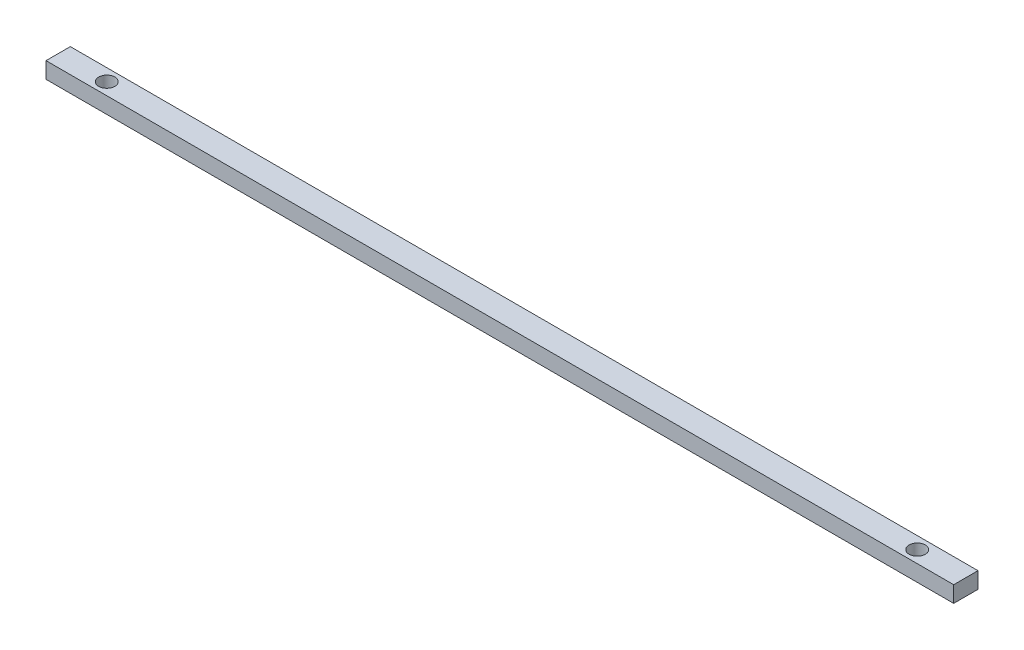
ISO-10303-21;
HEADER;
FILE_DESCRIPTION(('STEP AP214'),'2;1');
FILE_NAME('part.step','',(''),(''),'','','');
FILE_SCHEMA(('AUTOMOTIVE_DESIGN { 1 0 10303 214 1 1 1 1 }'));
ENDSEC;
DATA;
#1=APPLICATION_CONTEXT('core data for automotive mechanical design processes');
#2=APPLICATION_PROTOCOL_DEFINITION('international standard','automotive_design',2000,#1);
#3=PRODUCT_CONTEXT('',#1,'mechanical');
#4=PRODUCT('Part','Part','',(#3));
#5=PRODUCT_RELATED_PRODUCT_CATEGORY('part','',(#4));
#6=PRODUCT_DEFINITION_FORMATION('','',#4);
#7=PRODUCT_DEFINITION_CONTEXT('part definition',#1,'design');
#8=PRODUCT_DEFINITION('design','',#6,#7);
#9=PRODUCT_DEFINITION_SHAPE('','',#8);
#10=(LENGTH_UNIT() NAMED_UNIT(*) SI_UNIT(.MILLI.,.METRE.));
#11=(NAMED_UNIT(*) PLANE_ANGLE_UNIT() SI_UNIT($,.RADIAN.));
#12=(NAMED_UNIT(*) SI_UNIT($,.STERADIAN.) SOLID_ANGLE_UNIT());
#13=UNCERTAINTY_MEASURE_WITH_UNIT(LENGTH_MEASURE(1.E-05),#10,'distance_accuracy_value','');
#14=(GEOMETRIC_REPRESENTATION_CONTEXT(3) GLOBAL_UNCERTAINTY_ASSIGNED_CONTEXT((#13)) GLOBAL_UNIT_ASSIGNED_CONTEXT((#10,
#11,#12)) REPRESENTATION_CONTEXT('',''));
#15=CARTESIAN_POINT('',(0.,0.,0.));
#16=DIRECTION('',(0.,0.,1.));
#17=DIRECTION('',(1.,0.,0.));
#18=AXIS2_PLACEMENT_3D('',#15,#16,#17);
#19=CARTESIAN_POINT('',(560.,5.,-7.5));
#20=DIRECTION('',(0.,0.,1.));
#21=DIRECTION('',(0.,-1.,0.));
#22=AXIS2_PLACEMENT_3D('',#19,#20,#21);
#23=PLANE('',#22);
#24=DIRECTION('',(0.,1.,0.));
#25=VECTOR('',#24,1.);
#26=CARTESIAN_POINT('',(0.,5.,-7.5));
#27=LINE('',#26,#25);
#28=CARTESIAN_POINT('',(0.,-5.,-7.5));
#29=VERTEX_POINT('',#28);
#30=CARTESIAN_POINT('',(0.,5.,-7.5));
#31=VERTEX_POINT('',#30);
#32=EDGE_CURVE('E96',#29,#31,#27,.T.);
#33=ORIENTED_EDGE('',*,*,#32,.T.);
#34=DIRECTION('',(-1.,0.,0.));
#35=VECTOR('',#34,1.);
#36=CARTESIAN_POINT('',(560.,5.,-7.5));
#37=LINE('',#36,#35);
#38=CARTESIAN_POINT('',(560.,5.,-7.5));
#39=VERTEX_POINT('',#38);
#40=EDGE_CURVE('E11',#39,#31,#37,.T.);
#41=ORIENTED_EDGE('',*,*,#40,.F.);
#42=DIRECTION('',(0.,1.,0.));
#43=VECTOR('',#42,1.);
#44=CARTESIAN_POINT('',(560.,5.,-7.5));
#45=LINE('',#44,#43);
#46=CARTESIAN_POINT('',(560.,-5.,-7.5));
#47=VERTEX_POINT('',#46);
#48=EDGE_CURVE('E84',#47,#39,#45,.T.);
#49=ORIENTED_EDGE('',*,*,#48,.F.);
#50=DIRECTION('',(-1.,0.,0.));
#51=VECTOR('',#50,1.);
#52=CARTESIAN_POINT('',(560.,-5.,-7.5));
#53=LINE('',#52,#51);
#54=EDGE_CURVE('E92',#47,#29,#53,.T.);
#55=ORIENTED_EDGE('',*,*,#54,.T.);
#56=EDGE_LOOP('',(#33,#41,#49,#55));
#57=FACE_BOUND('',#56,.T.);
#58=ADVANCED_FACE('F33',(#57),#23,.F.);
#59=CARTESIAN_POINT('',(560.,5.,7.5));
#60=DIRECTION('',(0.,-1.,0.));
#61=DIRECTION('',(0.,0.,-1.));
#62=AXIS2_PLACEMENT_3D('',#59,#60,#61);
#63=PLANE('',#62);
#64=CARTESIAN_POINT('',(30.,5.,0.));
#65=DIRECTION('',(0.,1.,0.));
#66=DIRECTION('',(0.,0.,1.));
#67=AXIS2_PLACEMENT_3D('',#64,#65,#66);
#68=CIRCLE('',#67,5.);
#69=CARTESIAN_POINT('',(30.,5.,5.));
#70=VERTEX_POINT('',#69);
#71=EDGE_CURVE('E116',#70,#70,#68,.T.);
#72=ORIENTED_EDGE('',*,*,#71,.F.);
#73=EDGE_LOOP('',(#72));
#74=FACE_BOUND('',#73,.T.);
#75=CARTESIAN_POINT('',(530.,5.,0.));
#76=DIRECTION('',(0.,1.,0.));
#77=DIRECTION('',(0.,0.,1.));
#78=AXIS2_PLACEMENT_3D('',#75,#76,#77);
#79=CIRCLE('',#78,5.00000000000004);
#80=CARTESIAN_POINT('',(530.,5.,5.00000000000004));
#81=VERTEX_POINT('',#80);
#82=EDGE_CURVE('E110',#81,#81,#79,.T.);
#83=ORIENTED_EDGE('',*,*,#82,.F.);
#84=EDGE_LOOP('',(#83));
#85=FACE_BOUND('',#84,.T.);
#86=DIRECTION('',(0.,0.,1.));
#87=VECTOR('',#86,1.);
#88=CARTESIAN_POINT('',(0.,5.,7.5));
#89=LINE('',#88,#87);
#90=CARTESIAN_POINT('',(0.,5.,7.5));
#91=VERTEX_POINT('',#90);
#92=EDGE_CURVE('E88',#31,#91,#89,.T.);
#93=ORIENTED_EDGE('',*,*,#92,.T.);
#94=DIRECTION('',(-1.,0.,0.));
#95=VECTOR('',#94,1.);
#96=CARTESIAN_POINT('',(560.,5.,7.5));
#97=LINE('',#96,#95);
#98=CARTESIAN_POINT('',(560.,5.,7.5));
#99=VERTEX_POINT('',#98);
#100=EDGE_CURVE('E41',#99,#91,#97,.T.);
#101=ORIENTED_EDGE('',*,*,#100,.F.);
#102=DIRECTION('',(0.,0.,1.));
#103=VECTOR('',#102,1.);
#104=CARTESIAN_POINT('',(560.,5.,7.5));
#105=LINE('',#104,#103);
#106=EDGE_CURVE('E79',#39,#99,#105,.T.);
#107=ORIENTED_EDGE('',*,*,#106,.F.);
#108=ORIENTED_EDGE('',*,*,#40,.T.);
#109=EDGE_LOOP('',(#93,#101,#107,#108));
#110=FACE_BOUND('',#109,.T.);
#111=ADVANCED_FACE('F87',(#74,#85,#110),#63,.F.);
#112=CARTESIAN_POINT('',(560.,5.,7.5));
#113=DIRECTION('',(0.,0.,-1.));
#114=DIRECTION('',(0.,1.,0.));
#115=AXIS2_PLACEMENT_3D('',#112,#113,#114);
#116=PLANE('',#115);
#117=DIRECTION('',(0.,-1.,0.));
#118=VECTOR('',#117,1.);
#119=CARTESIAN_POINT('',(0.,5.,7.5));
#120=LINE('',#119,#118);
#121=CARTESIAN_POINT('',(0.,-5.,7.5));
#122=VERTEX_POINT('',#121);
#123=EDGE_CURVE('E66',#91,#122,#120,.T.);
#124=ORIENTED_EDGE('',*,*,#123,.T.);
#125=DIRECTION('',(-1.,0.,0.));
#126=VECTOR('',#125,1.);
#127=CARTESIAN_POINT('',(560.,-5.,7.5));
#128=LINE('',#127,#126);
#129=CARTESIAN_POINT('',(560.,-5.,7.5));
#130=VERTEX_POINT('',#129);
#131=EDGE_CURVE('E89',#130,#122,#128,.T.);
#132=ORIENTED_EDGE('',*,*,#131,.F.);
#133=DIRECTION('',(0.,-1.,0.));
#134=VECTOR('',#133,1.);
#135=CARTESIAN_POINT('',(560.,5.,7.5));
#136=LINE('',#135,#134);
#137=EDGE_CURVE('E82',#99,#130,#136,.T.);
#138=ORIENTED_EDGE('',*,*,#137,.F.);
#139=ORIENTED_EDGE('',*,*,#100,.T.);
#140=EDGE_LOOP('',(#124,#132,#138,#139));
#141=FACE_BOUND('',#140,.T.);
#142=ADVANCED_FACE('F90',(#141),#116,.F.);
#143=CARTESIAN_POINT('',(560.,-5.,7.5));
#144=DIRECTION('',(0.,1.,0.));
#145=DIRECTION('',(0.,0.,1.));
#146=AXIS2_PLACEMENT_3D('',#143,#144,#145);
#147=PLANE('',#146);
#148=CARTESIAN_POINT('',(30.,-5.,0.));
#149=DIRECTION('',(0.,1.,0.));
#150=DIRECTION('',(0.,0.,1.));
#151=AXIS2_PLACEMENT_3D('',#148,#149,#150);
#152=CIRCLE('',#151,5.);
#153=CARTESIAN_POINT('',(30.,-5.,5.));
#154=VERTEX_POINT('',#153);
#155=EDGE_CURVE('E99',#154,#154,#152,.T.);
#156=ORIENTED_EDGE('',*,*,#155,.T.);
#157=EDGE_LOOP('',(#156));
#158=FACE_BOUND('',#157,.T.);
#159=CARTESIAN_POINT('',(530.,-5.,0.));
#160=DIRECTION('',(0.,1.,0.));
#161=DIRECTION('',(0.,0.,1.));
#162=AXIS2_PLACEMENT_3D('',#159,#160,#161);
#163=CIRCLE('',#162,5.00000000000004);
#164=CARTESIAN_POINT('',(530.,-5.,5.00000000000004));
#165=VERTEX_POINT('',#164);
#166=EDGE_CURVE('E113',#165,#165,#163,.T.);
#167=ORIENTED_EDGE('',*,*,#166,.T.);
#168=EDGE_LOOP('',(#167));
#169=FACE_BOUND('',#168,.T.);
#170=DIRECTION('',(0.,0.,-1.));
#171=VECTOR('',#170,1.);
#172=CARTESIAN_POINT('',(0.,-5.,7.5));
#173=LINE('',#172,#171);
#174=EDGE_CURVE('E72',#122,#29,#173,.T.);
#175=ORIENTED_EDGE('',*,*,#174,.T.);
#176=ORIENTED_EDGE('',*,*,#54,.F.);
#177=DIRECTION('',(0.,0.,-1.));
#178=VECTOR('',#177,1.);
#179=CARTESIAN_POINT('',(560.,-5.,7.5));
#180=LINE('',#179,#178);
#181=EDGE_CURVE('E49',#130,#47,#180,.T.);
#182=ORIENTED_EDGE('',*,*,#181,.F.);
#183=ORIENTED_EDGE('',*,*,#131,.T.);
#184=EDGE_LOOP('',(#175,#176,#182,#183));
#185=FACE_BOUND('',#184,.T.);
#186=ADVANCED_FACE('F104',(#158,#169,#185),#147,.F.);
#187=CARTESIAN_POINT('',(560.,0.,0.));
#188=DIRECTION('',(1.,0.,0.));
#189=DIRECTION('',(0.,0.,-1.));
#190=AXIS2_PLACEMENT_3D('',#187,#188,#189);
#191=PLANE('',#190);
#192=ORIENTED_EDGE('',*,*,#48,.T.);
#193=ORIENTED_EDGE('',*,*,#106,.T.);
#194=ORIENTED_EDGE('',*,*,#137,.T.);
#195=ORIENTED_EDGE('',*,*,#181,.T.);
#196=EDGE_LOOP('',(#192,#193,#194,#195));
#197=FACE_BOUND('',#196,.T.);
#198=ADVANCED_FACE('F80',(#197),#191,.T.);
#199=CARTESIAN_POINT('',(0.,0.,0.));
#200=DIRECTION('',(1.,0.,0.));
#201=DIRECTION('',(0.,0.,-1.));
#202=AXIS2_PLACEMENT_3D('',#199,#200,#201);
#203=PLANE('',#202);
#204=ORIENTED_EDGE('',*,*,#32,.F.);
#205=ORIENTED_EDGE('',*,*,#174,.F.);
#206=ORIENTED_EDGE('',*,*,#123,.F.);
#207=ORIENTED_EDGE('',*,*,#92,.F.);
#208=EDGE_LOOP('',(#204,#205,#206,#207));
#209=FACE_BOUND('',#208,.T.);
#210=ADVANCED_FACE('F107',(#209),#203,.F.);
#211=CARTESIAN_POINT('',(530.,-5.,0.));
#212=DIRECTION('',(0.,1.,0.));
#213=DIRECTION('',(0.,0.,1.));
#214=AXIS2_PLACEMENT_3D('',#211,#212,#213);
#215=CYLINDRICAL_SURFACE('',#214,5.00000000000004);
#216=ORIENTED_EDGE('',*,*,#166,.F.);
#217=EDGE_LOOP('',(#216));
#218=FACE_BOUND('',#217,.T.);
#219=ORIENTED_EDGE('',*,*,#82,.T.);
#220=EDGE_LOOP('',(#219));
#221=FACE_BOUND('',#220,.T.);
#222=ADVANCED_FACE('F127',(#218,#221),#215,.F.);
#223=CARTESIAN_POINT('',(30.,-5.,0.));
#224=DIRECTION('',(0.,1.,0.));
#225=DIRECTION('',(0.,0.,1.));
#226=AXIS2_PLACEMENT_3D('',#223,#224,#225);
#227=CYLINDRICAL_SURFACE('',#226,5.);
#228=ORIENTED_EDGE('',*,*,#155,.F.);
#229=EDGE_LOOP('',(#228));
#230=FACE_BOUND('',#229,.T.);
#231=ORIENTED_EDGE('',*,*,#71,.T.);
#232=EDGE_LOOP('',(#231));
#233=FACE_BOUND('',#232,.T.);
#234=ADVANCED_FACE('F124',(#230,#233),#227,.F.);
#235=CLOSED_SHELL('',(#58,#111,#142,#186,#198,#210,#222,#234));
#236=MANIFOLD_SOLID_BREP('B2',#235);
#237=ADVANCED_BREP_SHAPE_REPRESENTATION('',(#18,#236),#14);
#238=SHAPE_DEFINITION_REPRESENTATION(#9,#237);
ENDSEC;
END-ISO-10303-21;
